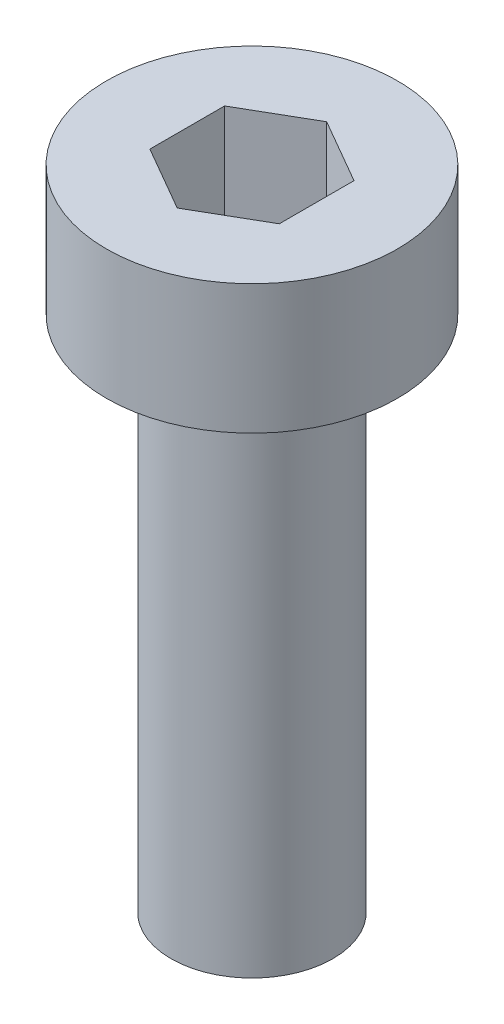
ISO-10303-21;
HEADER;
FILE_DESCRIPTION(('STEP AP214'),'2;1');
FILE_NAME('part.step','',(''),(''),'','','');
FILE_SCHEMA(('AUTOMOTIVE_DESIGN { 1 0 10303 214 1 1 1 1 }'));
ENDSEC;
DATA;
#1=APPLICATION_CONTEXT('core data for automotive mechanical design processes');
#2=APPLICATION_PROTOCOL_DEFINITION('international standard','automotive_design',2000,#1);
#3=PRODUCT_CONTEXT('',#1,'mechanical');
#4=PRODUCT('Part','Part','',(#3));
#5=PRODUCT_RELATED_PRODUCT_CATEGORY('part','',(#4));
#6=PRODUCT_DEFINITION_FORMATION('','',#4);
#7=PRODUCT_DEFINITION_CONTEXT('part definition',#1,'design');
#8=PRODUCT_DEFINITION('design','',#6,#7);
#9=PRODUCT_DEFINITION_SHAPE('','',#8);
#10=(LENGTH_UNIT() NAMED_UNIT(*) SI_UNIT(.MILLI.,.METRE.));
#11=(NAMED_UNIT(*) PLANE_ANGLE_UNIT() SI_UNIT($,.RADIAN.));
#12=(NAMED_UNIT(*) SI_UNIT($,.STERADIAN.) SOLID_ANGLE_UNIT());
#13=UNCERTAINTY_MEASURE_WITH_UNIT(LENGTH_MEASURE(1.E-05),#10,'distance_accuracy_value','');
#14=(GEOMETRIC_REPRESENTATION_CONTEXT(3) GLOBAL_UNCERTAINTY_ASSIGNED_CONTEXT((#13)) GLOBAL_UNIT_ASSIGNED_CONTEXT((#10,
#11,#12)) REPRESENTATION_CONTEXT('',''));
#15=CARTESIAN_POINT('',(0.,0.,0.));
#16=DIRECTION('',(0.,0.,1.));
#17=DIRECTION('',(1.,0.,0.));
#18=AXIS2_PLACEMENT_3D('',#15,#16,#17);
#19=CARTESIAN_POINT('',(0.,2.,0.));
#20=DIRECTION('',(0.,1.,0.));
#21=DIRECTION('',(0.,0.,1.));
#22=AXIS2_PLACEMENT_3D('',#19,#20,#21);
#23=PLANE('',#22);
#24=CARTESIAN_POINT('',(0.,2.,0.));
#25=DIRECTION('',(0.,1.,0.));
#26=DIRECTION('',(0.,0.,1.));
#27=AXIS2_PLACEMENT_3D('',#24,#25,#26);
#28=CIRCLE('',#27,2.25);
#29=CARTESIAN_POINT('',(0.,2.,2.25));
#30=VERTEX_POINT('',#29);
#31=EDGE_CURVE('E49',#30,#30,#28,.T.);
#32=ORIENTED_EDGE('',*,*,#31,.T.);
#33=EDGE_LOOP('',(#32));
#34=FACE_BOUND('',#33,.T.);
#35=DIRECTION('',(-0.866025403784439,0.,0.5));
#36=VECTOR('',#35,1.);
#37=CARTESIAN_POINT('',(0.,2.,-1.15470053837925));
#38=LINE('',#37,#36);
#39=CARTESIAN_POINT('',(0.,2.,-1.15470053837925));
#40=VERTEX_POINT('',#39);
#41=CARTESIAN_POINT('',(-1.,2.,-0.577350269189627));
#42=VERTEX_POINT('',#41);
#43=EDGE_CURVE('E111',#40,#42,#38,.T.);
#44=ORIENTED_EDGE('',*,*,#43,.F.);
#45=DIRECTION('',(-0.866025403784439,0.,-0.5));
#46=VECTOR('',#45,1.);
#47=CARTESIAN_POINT('',(1.,2.,-0.577350269189627));
#48=LINE('',#47,#46);
#49=CARTESIAN_POINT('',(1.,2.,-0.577350269189627));
#50=VERTEX_POINT('',#49);
#51=EDGE_CURVE('E91',#50,#40,#48,.T.);
#52=ORIENTED_EDGE('',*,*,#51,.F.);
#53=DIRECTION('',(0.,0.,-1.));
#54=VECTOR('',#53,1.);
#55=CARTESIAN_POINT('',(1.,2.,0.577350269189626));
#56=LINE('',#55,#54);
#57=CARTESIAN_POINT('',(1.,2.,0.577350269189626));
#58=VERTEX_POINT('',#57);
#59=EDGE_CURVE('E62',#58,#50,#56,.T.);
#60=ORIENTED_EDGE('',*,*,#59,.F.);
#61=DIRECTION('',(0.866025403784439,0.,-0.5));
#62=VECTOR('',#61,1.);
#63=CARTESIAN_POINT('',(0.,2.,1.15470053837925));
#64=LINE('',#63,#62);
#65=CARTESIAN_POINT('',(0.,2.,1.15470053837925));
#66=VERTEX_POINT('',#65);
#67=EDGE_CURVE('E122',#66,#58,#64,.T.);
#68=ORIENTED_EDGE('',*,*,#67,.F.);
#69=DIRECTION('',(0.866025403784438,0.,0.5));
#70=VECTOR('',#69,1.);
#71=CARTESIAN_POINT('',(-1.,2.,0.577350269189626));
#72=LINE('',#71,#70);
#73=CARTESIAN_POINT('',(-1.,2.,0.577350269189626));
#74=VERTEX_POINT('',#73);
#75=EDGE_CURVE('E110',#74,#66,#72,.T.);
#76=ORIENTED_EDGE('',*,*,#75,.F.);
#77=DIRECTION('',(0.,0.,1.));
#78=VECTOR('',#77,1.);
#79=CARTESIAN_POINT('',(-1.,2.,-0.577350269189627));
#80=LINE('',#79,#78);
#81=EDGE_CURVE('E100',#42,#74,#80,.T.);
#82=ORIENTED_EDGE('',*,*,#81,.F.);
#83=EDGE_LOOP('',(#44,#52,#60,#68,#76,#82));
#84=FACE_BOUND('',#83,.T.);
#85=ADVANCED_FACE('F41',(#34,#84),#23,.T.);
#86=CARTESIAN_POINT('',(0.,0.,0.));
#87=DIRECTION('',(0.,1.,0.));
#88=DIRECTION('',(0.,0.,1.));
#89=AXIS2_PLACEMENT_3D('',#86,#87,#88);
#90=PLANE('',#89);
#91=CARTESIAN_POINT('',(0.,0.,0.));
#92=DIRECTION('',(0.,1.,0.));
#93=DIRECTION('',(0.,0.,1.));
#94=AXIS2_PLACEMENT_3D('',#91,#92,#93);
#95=CIRCLE('',#94,1.25);
#96=CARTESIAN_POINT('',(0.,0.,1.25));
#97=VERTEX_POINT('',#96);
#98=EDGE_CURVE('E11',#97,#97,#95,.F.);
#99=ORIENTED_EDGE('',*,*,#98,.F.);
#100=EDGE_LOOP('',(#99));
#101=FACE_BOUND('',#100,.T.);
#102=CARTESIAN_POINT('',(0.,0.,0.));
#103=DIRECTION('',(0.,1.,0.));
#104=DIRECTION('',(0.,0.,1.));
#105=AXIS2_PLACEMENT_3D('',#102,#103,#104);
#106=CIRCLE('',#105,2.25);
#107=CARTESIAN_POINT('',(0.,0.,2.25));
#108=VERTEX_POINT('',#107);
#109=EDGE_CURVE('E151',#108,#108,#106,.T.);
#110=ORIENTED_EDGE('',*,*,#109,.F.);
#111=EDGE_LOOP('',(#110));
#112=FACE_BOUND('',#111,.T.);
#113=ADVANCED_FACE('F157',(#101,#112),#90,.F.);
#114=CARTESIAN_POINT('',(0.,2.,0.));
#115=DIRECTION('',(0.,-1.,0.));
#116=DIRECTION('',(0.,0.,-1.));
#117=AXIS2_PLACEMENT_3D('',#114,#115,#116);
#118=CYLINDRICAL_SURFACE('',#117,2.25);
#119=ORIENTED_EDGE('',*,*,#31,.F.);
#120=EDGE_LOOP('',(#119));
#121=FACE_BOUND('',#120,.T.);
#122=ORIENTED_EDGE('',*,*,#109,.T.);
#123=EDGE_LOOP('',(#122));
#124=FACE_BOUND('',#123,.T.);
#125=ADVANCED_FACE('F43',(#121,#124),#118,.T.);
#126=CARTESIAN_POINT('',(1.,2.,-0.577350269189627));
#127=DIRECTION('',(-0.5,0.,0.866025403784438));
#128=DIRECTION('',(0.866025403784439,0.,0.5));
#129=AXIS2_PLACEMENT_3D('',#126,#127,#128);
#130=PLANE('',#129);
#131=DIRECTION('',(-0.866025403784439,0.,-0.5));
#132=VECTOR('',#131,1.);
#133=CARTESIAN_POINT('',(1.,0.,-0.577350269189627));
#134=LINE('',#133,#132);
#135=CARTESIAN_POINT('',(1.,0.,-0.577350269189627));
#136=VERTEX_POINT('',#135);
#137=CARTESIAN_POINT('',(0.,0.,-1.15470053837925));
#138=VERTEX_POINT('',#137);
#139=EDGE_CURVE('E129',#136,#138,#134,.T.);
#140=ORIENTED_EDGE('',*,*,#139,.F.);
#141=DIRECTION('',(0.,-1.,0.));
#142=VECTOR('',#141,1.);
#143=CARTESIAN_POINT('',(1.,2.,-0.577350269189627));
#144=LINE('',#143,#142);
#145=EDGE_CURVE('E128',#50,#136,#144,.T.);
#146=ORIENTED_EDGE('',*,*,#145,.F.);
#147=ORIENTED_EDGE('',*,*,#51,.T.);
#148=DIRECTION('',(0.,-1.,0.));
#149=VECTOR('',#148,1.);
#150=CARTESIAN_POINT('',(0.,2.,-1.15470053837925));
#151=LINE('',#150,#149);
#152=EDGE_CURVE('E149',#40,#138,#151,.T.);
#153=ORIENTED_EDGE('',*,*,#152,.T.);
#154=EDGE_LOOP('',(#140,#146,#147,#153));
#155=FACE_BOUND('',#154,.T.);
#156=ADVANCED_FACE('F164',(#155),#130,.T.);
#157=CARTESIAN_POINT('',(0.,2.,-1.15470053837925));
#158=DIRECTION('',(0.5,0.,0.866025403784439));
#159=DIRECTION('',(0.866025403784439,0.,-0.5));
#160=AXIS2_PLACEMENT_3D('',#157,#158,#159);
#161=PLANE('',#160);
#162=DIRECTION('',(-0.866025403784439,0.,0.5));
#163=VECTOR('',#162,1.);
#164=CARTESIAN_POINT('',(0.,0.,-1.15470053837925));
#165=LINE('',#164,#163);
#166=CARTESIAN_POINT('',(-1.,0.,-0.577350269189627));
#167=VERTEX_POINT('',#166);
#168=EDGE_CURVE('E132',#138,#167,#165,.T.);
#169=ORIENTED_EDGE('',*,*,#168,.F.);
#170=ORIENTED_EDGE('',*,*,#152,.F.);
#171=ORIENTED_EDGE('',*,*,#43,.T.);
#172=DIRECTION('',(0.,-1.,0.));
#173=VECTOR('',#172,1.);
#174=CARTESIAN_POINT('',(-1.,2.,-0.577350269189627));
#175=LINE('',#174,#173);
#176=EDGE_CURVE('E106',#42,#167,#175,.T.);
#177=ORIENTED_EDGE('',*,*,#176,.T.);
#178=EDGE_LOOP('',(#169,#170,#171,#177));
#179=FACE_BOUND('',#178,.T.);
#180=ADVANCED_FACE('F172',(#179),#161,.T.);
#181=CARTESIAN_POINT('',(-1.,2.,-0.577350269189627));
#182=DIRECTION('',(1.,0.,0.));
#183=DIRECTION('',(0.,0.,-1.));
#184=AXIS2_PLACEMENT_3D('',#181,#182,#183);
#185=PLANE('',#184);
#186=DIRECTION('',(0.,0.,1.));
#187=VECTOR('',#186,1.);
#188=CARTESIAN_POINT('',(-1.,0.,-0.577350269189627));
#189=LINE('',#188,#187);
#190=CARTESIAN_POINT('',(-1.,0.,0.577350269189626));
#191=VERTEX_POINT('',#190);
#192=EDGE_CURVE('E136',#167,#191,#189,.T.);
#193=ORIENTED_EDGE('',*,*,#192,.F.);
#194=ORIENTED_EDGE('',*,*,#176,.F.);
#195=ORIENTED_EDGE('',*,*,#81,.T.);
#196=DIRECTION('',(0.,-1.,0.));
#197=VECTOR('',#196,1.);
#198=CARTESIAN_POINT('',(-1.,2.,0.577350269189626));
#199=LINE('',#198,#197);
#200=EDGE_CURVE('E104',#74,#191,#199,.T.);
#201=ORIENTED_EDGE('',*,*,#200,.T.);
#202=EDGE_LOOP('',(#193,#194,#195,#201));
#203=FACE_BOUND('',#202,.T.);
#204=ADVANCED_FACE('F103',(#203),#185,.T.);
#205=CARTESIAN_POINT('',(-1.,2.,0.577350269189626));
#206=DIRECTION('',(0.5,0.,-0.866025403784439));
#207=DIRECTION('',(-0.866025403784438,0.,-0.5));
#208=AXIS2_PLACEMENT_3D('',#205,#206,#207);
#209=PLANE('',#208);
#210=DIRECTION('',(0.866025403784438,0.,0.5));
#211=VECTOR('',#210,1.);
#212=CARTESIAN_POINT('',(-1.,0.,0.577350269189626));
#213=LINE('',#212,#211);
#214=CARTESIAN_POINT('',(0.,0.,1.15470053837925));
#215=VERTEX_POINT('',#214);
#216=EDGE_CURVE('E117',#191,#215,#213,.T.);
#217=ORIENTED_EDGE('',*,*,#216,.F.);
#218=ORIENTED_EDGE('',*,*,#200,.F.);
#219=ORIENTED_EDGE('',*,*,#75,.T.);
#220=DIRECTION('',(0.,-1.,0.));
#221=VECTOR('',#220,1.);
#222=CARTESIAN_POINT('',(0.,2.,1.15470053837925));
#223=LINE('',#222,#221);
#224=EDGE_CURVE('E119',#66,#215,#223,.T.);
#225=ORIENTED_EDGE('',*,*,#224,.T.);
#226=EDGE_LOOP('',(#217,#218,#219,#225));
#227=FACE_BOUND('',#226,.T.);
#228=ADVANCED_FACE('F114',(#227),#209,.T.);
#229=CARTESIAN_POINT('',(0.,2.,1.15470053837925));
#230=DIRECTION('',(-0.5,0.,-0.866025403784439));
#231=DIRECTION('',(-0.866025403784439,0.,0.5));
#232=AXIS2_PLACEMENT_3D('',#229,#230,#231);
#233=PLANE('',#232);
#234=DIRECTION('',(0.866025403784439,0.,-0.5));
#235=VECTOR('',#234,1.);
#236=CARTESIAN_POINT('',(0.,0.,1.15470053837925));
#237=LINE('',#236,#235);
#238=CARTESIAN_POINT('',(1.,0.,0.577350269189626));
#239=VERTEX_POINT('',#238);
#240=EDGE_CURVE('E139',#215,#239,#237,.T.);
#241=ORIENTED_EDGE('',*,*,#240,.F.);
#242=ORIENTED_EDGE('',*,*,#224,.F.);
#243=ORIENTED_EDGE('',*,*,#67,.T.);
#244=DIRECTION('',(0.,-1.,0.));
#245=VECTOR('',#244,1.);
#246=CARTESIAN_POINT('',(1.,2.,0.577350269189626));
#247=LINE('',#246,#245);
#248=EDGE_CURVE('E56',#58,#239,#247,.T.);
#249=ORIENTED_EDGE('',*,*,#248,.T.);
#250=EDGE_LOOP('',(#241,#242,#243,#249));
#251=FACE_BOUND('',#250,.T.);
#252=ADVANCED_FACE('F180',(#251),#233,.T.);
#253=CARTESIAN_POINT('',(1.,2.,0.577350269189626));
#254=DIRECTION('',(-1.,0.,0.));
#255=DIRECTION('',(0.,0.,1.));
#256=AXIS2_PLACEMENT_3D('',#253,#254,#255);
#257=PLANE('',#256);
#258=DIRECTION('',(0.,0.,-1.));
#259=VECTOR('',#258,1.);
#260=CARTESIAN_POINT('',(1.,0.,0.577350269189626));
#261=LINE('',#260,#259);
#262=EDGE_CURVE('E142',#239,#136,#261,.T.);
#263=ORIENTED_EDGE('',*,*,#262,.F.);
#264=ORIENTED_EDGE('',*,*,#248,.F.);
#265=ORIENTED_EDGE('',*,*,#59,.T.);
#266=ORIENTED_EDGE('',*,*,#145,.T.);
#267=EDGE_LOOP('',(#263,#264,#265,#266));
#268=FACE_BOUND('',#267,.T.);
#269=ADVANCED_FACE('F183',(#268),#257,.T.);
#270=CARTESIAN_POINT('',(0.,0.,0.));
#271=DIRECTION('',(0.,-1.,0.));
#272=DIRECTION('',(0.,0.,-1.));
#273=AXIS2_PLACEMENT_3D('',#270,#271,#272);
#274=PLANE('',#273);
#275=ORIENTED_EDGE('',*,*,#139,.T.);
#276=ORIENTED_EDGE('',*,*,#168,.T.);
#277=ORIENTED_EDGE('',*,*,#192,.T.);
#278=ORIENTED_EDGE('',*,*,#216,.T.);
#279=ORIENTED_EDGE('',*,*,#240,.T.);
#280=ORIENTED_EDGE('',*,*,#262,.T.);
#281=EDGE_LOOP('',(#275,#276,#277,#278,#279,#280));
#282=FACE_BOUND('',#281,.T.);
#283=ADVANCED_FACE('F186',(#282),#274,.F.);
#284=CARTESIAN_POINT('',(0.,-8.,0.));
#285=DIRECTION('',(0.,1.,0.));
#286=DIRECTION('',(0.,0.,1.));
#287=AXIS2_PLACEMENT_3D('',#284,#285,#286);
#288=CYLINDRICAL_SURFACE('',#287,1.25);
#289=CARTESIAN_POINT('',(0.,-8.,0.));
#290=DIRECTION('',(0.,-1.,0.));
#291=DIRECTION('',(0.,0.,-1.));
#292=AXIS2_PLACEMENT_3D('',#289,#290,#291);
#293=CIRCLE('',#292,1.25);
#294=CARTESIAN_POINT('',(0.,-8.,-1.25));
#295=VERTEX_POINT('',#294);
#296=EDGE_CURVE('E133',#295,#295,#293,.T.);
#297=ORIENTED_EDGE('',*,*,#296,.F.);
#298=EDGE_LOOP('',(#297));
#299=FACE_BOUND('',#298,.T.);
#300=ORIENTED_EDGE('',*,*,#98,.T.);
#301=EDGE_LOOP('',(#300));
#302=FACE_BOUND('',#301,.T.);
#303=ADVANCED_FACE('F187',(#299,#302),#288,.T.);
#304=CARTESIAN_POINT('',(0.,-8.,0.));
#305=DIRECTION('',(0.,-1.,0.));
#306=DIRECTION('',(0.,0.,-1.));
#307=AXIS2_PLACEMENT_3D('',#304,#305,#306);
#308=PLANE('',#307);
#309=ORIENTED_EDGE('',*,*,#296,.T.);
#310=EDGE_LOOP('',(#309));
#311=FACE_BOUND('',#310,.T.);
#312=ADVANCED_FACE('F190',(#311),#308,.T.);
#313=CLOSED_SHELL('',(#85,#113,#125,#156,#180,#204,#228,#252,#269,#283,#303,#312));
#314=MANIFOLD_SOLID_BREP('B2',#313);
#315=ADVANCED_BREP_SHAPE_REPRESENTATION('',(#18,#314),#14);
#316=SHAPE_DEFINITION_REPRESENTATION(#9,#315);
ENDSEC;
END-ISO-10303-21;
